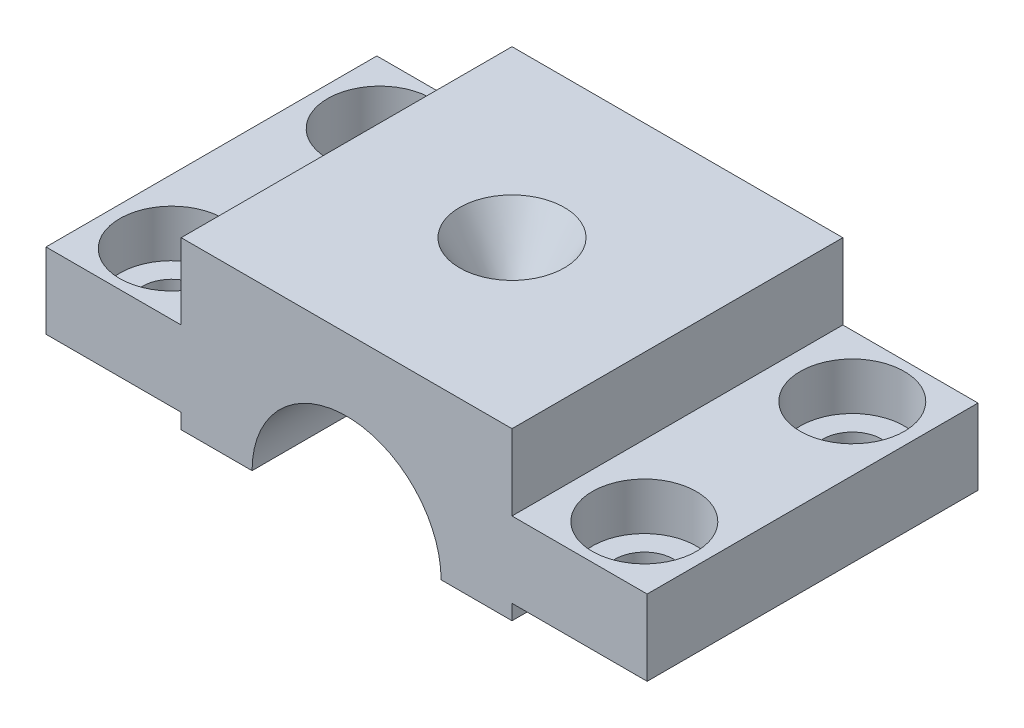
ISO-10303-21;
HEADER;
FILE_DESCRIPTION(('STEP AP214'),'2;1');
FILE_NAME('part.step','',(''),(''),'','','');
FILE_SCHEMA(('AUTOMOTIVE_DESIGN { 1 0 10303 214 1 1 1 1 }'));
ENDSEC;
DATA;
#1=APPLICATION_CONTEXT('core data for automotive mechanical design processes');
#2=APPLICATION_PROTOCOL_DEFINITION('international standard','automotive_design',2000,#1);
#3=PRODUCT_CONTEXT('',#1,'mechanical');
#4=PRODUCT('Part','Part','',(#3));
#5=PRODUCT_RELATED_PRODUCT_CATEGORY('part','',(#4));
#6=PRODUCT_DEFINITION_FORMATION('','',#4);
#7=PRODUCT_DEFINITION_CONTEXT('part definition',#1,'design');
#8=PRODUCT_DEFINITION('design','',#6,#7);
#9=PRODUCT_DEFINITION_SHAPE('','',#8);
#10=(LENGTH_UNIT() NAMED_UNIT(*) SI_UNIT(.MILLI.,.METRE.));
#11=(NAMED_UNIT(*) PLANE_ANGLE_UNIT() SI_UNIT($,.RADIAN.));
#12=(NAMED_UNIT(*) SI_UNIT($,.STERADIAN.) SOLID_ANGLE_UNIT());
#13=UNCERTAINTY_MEASURE_WITH_UNIT(LENGTH_MEASURE(1.E-05),#10,'distance_accuracy_value','');
#14=(GEOMETRIC_REPRESENTATION_CONTEXT(3) GLOBAL_UNCERTAINTY_ASSIGNED_CONTEXT((#13)) GLOBAL_UNIT_ASSIGNED_CONTEXT((#10,
#11,#12)) REPRESENTATION_CONTEXT('',''));
#15=CARTESIAN_POINT('',(0.,0.,0.));
#16=DIRECTION('',(0.,0.,1.));
#17=DIRECTION('',(1.,0.,0.));
#18=AXIS2_PLACEMENT_3D('',#15,#16,#17);
#19=CARTESIAN_POINT('',(-15.9,0.,8.75));
#20=DIRECTION('',(0.,1.,0.));
#21=DIRECTION('',(0.,0.,1.));
#22=AXIS2_PLACEMENT_3D('',#19,#20,#21);
#23=PLANE('',#22);
#24=DIRECTION('',(1.,0.,0.));
#25=VECTOR('',#24,1.);
#26=CARTESIAN_POINT('',(-15.9,0.,-8.75));
#27=LINE('',#26,#25);
#28=CARTESIAN_POINT('',(-8.75,0.,-8.75));
#29=VERTEX_POINT('',#28);
#30=CARTESIAN_POINT('',(-5.,0.,-8.75));
#31=VERTEX_POINT('',#30);
#32=EDGE_CURVE('E174',#29,#31,#27,.T.);
#33=ORIENTED_EDGE('',*,*,#32,.T.);
#34=DIRECTION('',(0.,0.,1.));
#35=VECTOR('',#34,1.);
#36=CARTESIAN_POINT('',(-5.,0.,-8.75));
#37=LINE('',#36,#35);
#38=CARTESIAN_POINT('',(-5.,0.,8.75));
#39=VERTEX_POINT('',#38);
#40=EDGE_CURVE('E11',#31,#39,#37,.T.);
#41=ORIENTED_EDGE('',*,*,#40,.T.);
#42=DIRECTION('',(1.,0.,0.));
#43=VECTOR('',#42,1.);
#44=CARTESIAN_POINT('',(-15.9,0.,8.75));
#45=LINE('',#44,#43);
#46=CARTESIAN_POINT('',(-8.75,0.,8.75));
#47=VERTEX_POINT('',#46);
#48=EDGE_CURVE('E153',#47,#39,#45,.T.);
#49=ORIENTED_EDGE('',*,*,#48,.F.);
#50=DIRECTION('',(0.,0.,-1.));
#51=VECTOR('',#50,1.);
#52=CARTESIAN_POINT('',(-8.75,0.,8.75));
#53=LINE('',#52,#51);
#54=EDGE_CURVE('E230',#47,#29,#53,.T.);
#55=ORIENTED_EDGE('',*,*,#54,.T.);
#56=EDGE_LOOP('',(#33,#41,#49,#55));
#57=FACE_BOUND('',#56,.T.);
#58=ADVANCED_FACE('F33',(#57),#23,.F.);
#59=CARTESIAN_POINT('',(0.,0.,8.75));
#60=DIRECTION('',(0.,0.,-1.));
#61=DIRECTION('',(-1.,0.,0.));
#62=AXIS2_PLACEMENT_3D('',#59,#60,#61);
#63=PLANE('',#62);
#64=ORIENTED_EDGE('',*,*,#48,.T.);
#65=CARTESIAN_POINT('',(0.,0.,8.75));
#66=DIRECTION('',(0.,0.,1.));
#67=DIRECTION('',(1.,0.,0.));
#68=AXIS2_PLACEMENT_3D('',#65,#66,#67);
#69=CIRCLE('',#68,5.);
#70=CARTESIAN_POINT('',(5.,0.,8.75));
#71=VERTEX_POINT('',#70);
#72=EDGE_CURVE('E139',#71,#39,#69,.T.);
#73=ORIENTED_EDGE('',*,*,#72,.F.);
#74=CARTESIAN_POINT('',(8.75,0.,8.75));
#75=VERTEX_POINT('',#74);
#76=EDGE_CURVE('E149',#71,#75,#45,.T.);
#77=ORIENTED_EDGE('',*,*,#76,.T.);
#78=DIRECTION('',(0.,-1.,0.));
#79=VECTOR('',#78,1.);
#80=CARTESIAN_POINT('',(8.75,0.8,8.75));
#81=LINE('',#80,#79);
#82=CARTESIAN_POINT('',(8.75,0.8,8.75));
#83=VERTEX_POINT('',#82);
#84=EDGE_CURVE('E292',#83,#75,#81,.T.);
#85=ORIENTED_EDGE('',*,*,#84,.F.);
#86=DIRECTION('',(-1.,0.,0.));
#87=VECTOR('',#86,1.);
#88=CARTESIAN_POINT('',(15.9,0.8,8.75));
#89=LINE('',#88,#87);
#90=CARTESIAN_POINT('',(15.9,0.8,8.75));
#91=VERTEX_POINT('',#90);
#92=EDGE_CURVE('E285',#91,#83,#89,.T.);
#93=ORIENTED_EDGE('',*,*,#92,.F.);
#94=DIRECTION('',(0.,1.,0.));
#95=VECTOR('',#94,1.);
#96=CARTESIAN_POINT('',(15.9,0.,8.75));
#97=LINE('',#96,#95);
#98=CARTESIAN_POINT('',(15.9,4.8,8.75));
#99=VERTEX_POINT('',#98);
#100=EDGE_CURVE('E161',#91,#99,#97,.T.);
#101=ORIENTED_EDGE('',*,*,#100,.T.);
#102=DIRECTION('',(1.,0.,0.));
#103=VECTOR('',#102,1.);
#104=CARTESIAN_POINT('',(8.75,4.8,8.75));
#105=LINE('',#104,#103);
#106=CARTESIAN_POINT('',(8.75,4.8,8.75));
#107=VERTEX_POINT('',#106);
#108=EDGE_CURVE('E270',#107,#99,#105,.T.);
#109=ORIENTED_EDGE('',*,*,#108,.F.);
#110=DIRECTION('',(0.,-1.,0.));
#111=VECTOR('',#110,1.);
#112=CARTESIAN_POINT('',(8.75,8.8,8.75));
#113=LINE('',#112,#111);
#114=CARTESIAN_POINT('',(8.75,8.8,8.75));
#115=VERTEX_POINT('',#114);
#116=EDGE_CURVE('E185',#115,#107,#113,.T.);
#117=ORIENTED_EDGE('',*,*,#116,.F.);
#118=DIRECTION('',(-1.,0.,0.));
#119=VECTOR('',#118,1.);
#120=CARTESIAN_POINT('',(-15.9,8.8,8.75));
#121=LINE('',#120,#119);
#122=CARTESIAN_POINT('',(-8.75,8.8,8.75));
#123=VERTEX_POINT('',#122);
#124=EDGE_CURVE('E143',#115,#123,#121,.T.);
#125=ORIENTED_EDGE('',*,*,#124,.T.);
#126=DIRECTION('',(0.,-1.,0.));
#127=VECTOR('',#126,1.);
#128=CARTESIAN_POINT('',(-8.75,8.8,8.75));
#129=LINE('',#128,#127);
#130=CARTESIAN_POINT('',(-8.75,4.8,8.75));
#131=VERTEX_POINT('',#130);
#132=EDGE_CURVE('E61',#123,#131,#129,.T.);
#133=ORIENTED_EDGE('',*,*,#132,.T.);
#134=DIRECTION('',(-1.,0.,0.));
#135=VECTOR('',#134,1.);
#136=CARTESIAN_POINT('',(-8.75,4.8,8.75));
#137=LINE('',#136,#135);
#138=CARTESIAN_POINT('',(-15.9,4.8,8.75));
#139=VERTEX_POINT('',#138);
#140=EDGE_CURVE('E222',#131,#139,#137,.T.);
#141=ORIENTED_EDGE('',*,*,#140,.T.);
#142=DIRECTION('',(0.,-1.,0.));
#143=VECTOR('',#142,1.);
#144=CARTESIAN_POINT('',(-15.9,0.,8.75));
#145=LINE('',#144,#143);
#146=CARTESIAN_POINT('',(-15.9,0.8,8.75));
#147=VERTEX_POINT('',#146);
#148=EDGE_CURVE('E159',#139,#147,#145,.T.);
#149=ORIENTED_EDGE('',*,*,#148,.T.);
#150=DIRECTION('',(1.,0.,0.));
#151=VECTOR('',#150,1.);
#152=CARTESIAN_POINT('',(-15.9,0.8,8.75));
#153=LINE('',#152,#151);
#154=CARTESIAN_POINT('',(-8.75,0.8,8.75));
#155=VERTEX_POINT('',#154);
#156=EDGE_CURVE('E242',#147,#155,#153,.T.);
#157=ORIENTED_EDGE('',*,*,#156,.T.);
#158=DIRECTION('',(0.,-1.,0.));
#159=VECTOR('',#158,1.);
#160=CARTESIAN_POINT('',(-8.75,0.8,8.75));
#161=LINE('',#160,#159);
#162=EDGE_CURVE('E248',#155,#47,#161,.T.);
#163=ORIENTED_EDGE('',*,*,#162,.T.);
#164=EDGE_LOOP('',(#64,#73,#77,#85,#93,#101,#109,#117,#125,#133,#141,#149,#157,#163));
#165=FACE_BOUND('',#164,.T.);
#166=ADVANCED_FACE('F147',(#165),#63,.F.);
#167=CARTESIAN_POINT('',(0.,0.,-8.75));
#168=DIRECTION('',(0.,0.,-1.));
#169=DIRECTION('',(-1.,0.,0.));
#170=AXIS2_PLACEMENT_3D('',#167,#168,#169);
#171=PLANE('',#170);
#172=CARTESIAN_POINT('',(0.,0.,-8.75));
#173=DIRECTION('',(0.,0.,1.));
#174=DIRECTION('',(1.,0.,0.));
#175=AXIS2_PLACEMENT_3D('',#172,#173,#174);
#176=CIRCLE('',#175,5.);
#177=CARTESIAN_POINT('',(5.,0.,-8.75));
#178=VERTEX_POINT('',#177);
#179=EDGE_CURVE('E53',#178,#31,#176,.T.);
#180=ORIENTED_EDGE('',*,*,#179,.T.);
#181=ORIENTED_EDGE('',*,*,#32,.F.);
#182=DIRECTION('',(0.,-1.,0.));
#183=VECTOR('',#182,1.);
#184=CARTESIAN_POINT('',(-8.75,0.8,-8.75));
#185=LINE('',#184,#183);
#186=CARTESIAN_POINT('',(-8.75,0.8,-8.75));
#187=VERTEX_POINT('',#186);
#188=EDGE_CURVE('E245',#187,#29,#185,.T.);
#189=ORIENTED_EDGE('',*,*,#188,.F.);
#190=DIRECTION('',(-1.,0.,0.));
#191=VECTOR('',#190,1.);
#192=CARTESIAN_POINT('',(-15.9,0.8,-8.75));
#193=LINE('',#192,#191);
#194=CARTESIAN_POINT('',(-15.9,0.8,-8.75));
#195=VERTEX_POINT('',#194);
#196=EDGE_CURVE('E237',#187,#195,#193,.T.);
#197=ORIENTED_EDGE('',*,*,#196,.T.);
#198=DIRECTION('',(0.,-1.,0.));
#199=VECTOR('',#198,1.);
#200=CARTESIAN_POINT('',(-15.9,0.,-8.75));
#201=LINE('',#200,#199);
#202=CARTESIAN_POINT('',(-15.9,4.8,-8.75));
#203=VERTEX_POINT('',#202);
#204=EDGE_CURVE('E170',#203,#195,#201,.T.);
#205=ORIENTED_EDGE('',*,*,#204,.F.);
#206=DIRECTION('',(-1.,0.,0.));
#207=VECTOR('',#206,1.);
#208=CARTESIAN_POINT('',(-8.75,4.8,-8.75));
#209=LINE('',#208,#207);
#210=CARTESIAN_POINT('',(-8.75,4.8,-8.75));
#211=VERTEX_POINT('',#210);
#212=EDGE_CURVE('E221',#211,#203,#209,.T.);
#213=ORIENTED_EDGE('',*,*,#212,.F.);
#214=DIRECTION('',(0.,-1.,0.));
#215=VECTOR('',#214,1.);
#216=CARTESIAN_POINT('',(-8.75,8.8,-8.75));
#217=LINE('',#216,#215);
#218=CARTESIAN_POINT('',(-8.75,8.8,-8.75));
#219=VERTEX_POINT('',#218);
#220=EDGE_CURVE('E219',#219,#211,#217,.T.);
#221=ORIENTED_EDGE('',*,*,#220,.F.);
#222=DIRECTION('',(-1.,0.,0.));
#223=VECTOR('',#222,1.);
#224=CARTESIAN_POINT('',(-15.9,8.8,-8.75));
#225=LINE('',#224,#223);
#226=CARTESIAN_POINT('',(8.75,8.8,-8.75));
#227=VERTEX_POINT('',#226);
#228=EDGE_CURVE('E162',#227,#219,#225,.T.);
#229=ORIENTED_EDGE('',*,*,#228,.F.);
#230=DIRECTION('',(0.,-1.,0.));
#231=VECTOR('',#230,1.);
#232=CARTESIAN_POINT('',(8.75,8.8,-8.75));
#233=LINE('',#232,#231);
#234=CARTESIAN_POINT('',(8.75,4.8,-8.75));
#235=VERTEX_POINT('',#234);
#236=EDGE_CURVE('E266',#227,#235,#233,.T.);
#237=ORIENTED_EDGE('',*,*,#236,.T.);
#238=DIRECTION('',(1.,0.,0.));
#239=VECTOR('',#238,1.);
#240=CARTESIAN_POINT('',(8.75,4.8,-8.75));
#241=LINE('',#240,#239);
#242=CARTESIAN_POINT('',(15.9,4.8,-8.75));
#243=VERTEX_POINT('',#242);
#244=EDGE_CURVE('E269',#235,#243,#241,.T.);
#245=ORIENTED_EDGE('',*,*,#244,.T.);
#246=DIRECTION('',(0.,1.,0.));
#247=VECTOR('',#246,1.);
#248=CARTESIAN_POINT('',(15.9,0.,-8.75));
#249=LINE('',#248,#247);
#250=CARTESIAN_POINT('',(15.9,0.8,-8.75));
#251=VERTEX_POINT('',#250);
#252=EDGE_CURVE('E177',#251,#243,#249,.T.);
#253=ORIENTED_EDGE('',*,*,#252,.F.);
#254=DIRECTION('',(1.,0.,0.));
#255=VECTOR('',#254,1.);
#256=CARTESIAN_POINT('',(15.9,0.8,-8.75));
#257=LINE('',#256,#255);
#258=CARTESIAN_POINT('',(8.75,0.8,-8.75));
#259=VERTEX_POINT('',#258);
#260=EDGE_CURVE('E290',#259,#251,#257,.T.);
#261=ORIENTED_EDGE('',*,*,#260,.F.);
#262=DIRECTION('',(0.,-1.,0.));
#263=VECTOR('',#262,1.);
#264=CARTESIAN_POINT('',(8.75,0.8,-8.75));
#265=LINE('',#264,#263);
#266=CARTESIAN_POINT('',(8.75,0.,-8.75));
#267=VERTEX_POINT('',#266);
#268=EDGE_CURVE('E173',#259,#267,#265,.T.);
#269=ORIENTED_EDGE('',*,*,#268,.T.);
#270=EDGE_CURVE('E172',#178,#267,#27,.T.);
#271=ORIENTED_EDGE('',*,*,#270,.F.);
#272=EDGE_LOOP('',(#180,#181,#189,#197,#205,#213,#221,#229,#237,#245,#253,#261,#269,#271));
#273=FACE_BOUND('',#272,.T.);
#274=ADVANCED_FACE('F310',(#273),#171,.T.);
#275=CARTESIAN_POINT('',(-15.9,0.,8.75));
#276=DIRECTION('',(1.,0.,0.));
#277=DIRECTION('',(0.,0.,-1.));
#278=AXIS2_PLACEMENT_3D('',#275,#276,#277);
#279=PLANE('',#278);
#280=DIRECTION('',(0.,0.,1.));
#281=VECTOR('',#280,1.);
#282=CARTESIAN_POINT('',(-15.9,4.8,-8.75));
#283=LINE('',#282,#281);
#284=EDGE_CURVE('E231',#203,#139,#283,.T.);
#285=ORIENTED_EDGE('',*,*,#284,.F.);
#286=ORIENTED_EDGE('',*,*,#204,.T.);
#287=DIRECTION('',(0.,0.,1.));
#288=VECTOR('',#287,1.);
#289=CARTESIAN_POINT('',(-15.9,0.8,8.75));
#290=LINE('',#289,#288);
#291=EDGE_CURVE('E234',#195,#147,#290,.T.);
#292=ORIENTED_EDGE('',*,*,#291,.T.);
#293=ORIENTED_EDGE('',*,*,#148,.F.);
#294=EDGE_LOOP('',(#285,#286,#292,#293));
#295=FACE_BOUND('',#294,.T.);
#296=ADVANCED_FACE('F35',(#295),#279,.F.);
#297=CARTESIAN_POINT('',(-15.9,8.8,8.75));
#298=DIRECTION('',(0.,-1.,0.));
#299=DIRECTION('',(0.,0.,-1.));
#300=AXIS2_PLACEMENT_3D('',#297,#298,#299);
#301=PLANE('',#300);
#302=CARTESIAN_POINT('',(0.,8.80000000000001,0.));
#303=DIRECTION('',(0.,-1.,0.));
#304=DIRECTION('',(0.,0.,-1.));
#305=AXIS2_PLACEMENT_3D('',#302,#303,#304);
#306=CIRCLE('',#305,2.77072594216366);
#307=CARTESIAN_POINT('',(0.,8.80000000000001,2.77072594216366));
#308=VERTEX_POINT('',#307);
#309=EDGE_CURVE('E342',#308,#308,#306,.T.);
#310=ORIENTED_EDGE('',*,*,#309,.T.);
#311=EDGE_LOOP('',(#310));
#312=FACE_BOUND('',#311,.T.);
#313=DIRECTION('',(0.,0.,1.));
#314=VECTOR('',#313,1.);
#315=CARTESIAN_POINT('',(-8.75,8.8,-8.75));
#316=LINE('',#315,#314);
#317=EDGE_CURVE('E224',#219,#123,#316,.T.);
#318=ORIENTED_EDGE('',*,*,#317,.T.);
#319=ORIENTED_EDGE('',*,*,#124,.F.);
#320=DIRECTION('',(0.,0.,1.));
#321=VECTOR('',#320,1.);
#322=CARTESIAN_POINT('',(8.75,8.8,-8.75));
#323=LINE('',#322,#321);
#324=EDGE_CURVE('E277',#227,#115,#323,.T.);
#325=ORIENTED_EDGE('',*,*,#324,.F.);
#326=ORIENTED_EDGE('',*,*,#228,.T.);
#327=EDGE_LOOP('',(#318,#319,#325,#326));
#328=FACE_BOUND('',#327,.T.);
#329=ADVANCED_FACE('F320',(#312,#328),#301,.F.);
#330=ORIENTED_EDGE('',*,*,#76,.F.);
#331=DIRECTION('',(0.,0.,1.));
#332=VECTOR('',#331,1.);
#333=CARTESIAN_POINT('',(5.,0.,-8.75));
#334=LINE('',#333,#332);
#335=EDGE_CURVE('E46',#71,#178,#334,.F.);
#336=ORIENTED_EDGE('',*,*,#335,.T.);
#337=ORIENTED_EDGE('',*,*,#270,.T.);
#338=DIRECTION('',(0.,0.,-1.));
#339=VECTOR('',#338,1.);
#340=CARTESIAN_POINT('',(8.75,0.,8.75));
#341=LINE('',#340,#339);
#342=EDGE_CURVE('E158',#75,#267,#341,.T.);
#343=ORIENTED_EDGE('',*,*,#342,.F.);
#344=EDGE_LOOP('',(#330,#336,#337,#343));
#345=FACE_BOUND('',#344,.T.);
#346=ADVANCED_FACE('F156',(#345),#23,.F.);
#347=CARTESIAN_POINT('',(15.9,0.,8.75));
#348=DIRECTION('',(-1.,0.,0.));
#349=DIRECTION('',(0.,0.,1.));
#350=AXIS2_PLACEMENT_3D('',#347,#348,#349);
#351=PLANE('',#350);
#352=ORIENTED_EDGE('',*,*,#252,.T.);
#353=DIRECTION('',(0.,0.,1.));
#354=VECTOR('',#353,1.);
#355=CARTESIAN_POINT('',(15.9,4.8,-8.75));
#356=LINE('',#355,#354);
#357=EDGE_CURVE('E279',#243,#99,#356,.T.);
#358=ORIENTED_EDGE('',*,*,#357,.T.);
#359=ORIENTED_EDGE('',*,*,#100,.F.);
#360=DIRECTION('',(0.,0.,1.));
#361=VECTOR('',#360,1.);
#362=CARTESIAN_POINT('',(15.9,0.8,8.75));
#363=LINE('',#362,#361);
#364=EDGE_CURVE('E283',#251,#91,#363,.T.);
#365=ORIENTED_EDGE('',*,*,#364,.F.);
#366=EDGE_LOOP('',(#352,#358,#359,#365));
#367=FACE_BOUND('',#366,.T.);
#368=ADVANCED_FACE('F304',(#367),#351,.F.);
#369=CARTESIAN_POINT('',(8.75,0.8,8.75));
#370=DIRECTION('',(-1.,0.,0.));
#371=DIRECTION('',(0.,0.,1.));
#372=AXIS2_PLACEMENT_3D('',#369,#370,#371);
#373=PLANE('',#372);
#374=ORIENTED_EDGE('',*,*,#342,.T.);
#375=ORIENTED_EDGE('',*,*,#268,.F.);
#376=DIRECTION('',(0.,0.,-1.));
#377=VECTOR('',#376,1.);
#378=CARTESIAN_POINT('',(8.75,0.8,8.75));
#379=LINE('',#378,#377);
#380=EDGE_CURVE('E288',#83,#259,#379,.T.);
#381=ORIENTED_EDGE('',*,*,#380,.F.);
#382=ORIENTED_EDGE('',*,*,#84,.T.);
#383=EDGE_LOOP('',(#374,#375,#381,#382));
#384=FACE_BOUND('',#383,.T.);
#385=ADVANCED_FACE('F296',(#384),#373,.F.);
#386=CARTESIAN_POINT('',(0.,0.8,0.));
#387=DIRECTION('',(0.,1.,0.));
#388=DIRECTION('',(0.,0.,1.));
#389=AXIS2_PLACEMENT_3D('',#386,#387,#388);
#390=PLANE('',#389);
#391=CARTESIAN_POINT('',(12.5,0.8,-5.5));
#392=DIRECTION('',(0.,1.,0.));
#393=DIRECTION('',(0.,0.,1.));
#394=AXIS2_PLACEMENT_3D('',#391,#392,#393);
#395=CIRCLE('',#394,1.55);
#396=CARTESIAN_POINT('',(12.5,0.8,-3.95));
#397=VERTEX_POINT('',#396);
#398=EDGE_CURVE('E187',#397,#397,#395,.T.);
#399=ORIENTED_EDGE('',*,*,#398,.T.);
#400=EDGE_LOOP('',(#399));
#401=FACE_BOUND('',#400,.T.);
#402=CARTESIAN_POINT('',(12.5,0.8,5.5));
#403=DIRECTION('',(0.,1.,0.));
#404=DIRECTION('',(0.,0.,1.));
#405=AXIS2_PLACEMENT_3D('',#402,#403,#404);
#406=CIRCLE('',#405,1.55);
#407=CARTESIAN_POINT('',(12.5,0.8,7.05));
#408=VERTEX_POINT('',#407);
#409=EDGE_CURVE('E182',#408,#408,#406,.T.);
#410=ORIENTED_EDGE('',*,*,#409,.T.);
#411=EDGE_LOOP('',(#410));
#412=FACE_BOUND('',#411,.T.);
#413=ORIENTED_EDGE('',*,*,#364,.T.);
#414=ORIENTED_EDGE('',*,*,#92,.T.);
#415=ORIENTED_EDGE('',*,*,#380,.T.);
#416=ORIENTED_EDGE('',*,*,#260,.T.);
#417=EDGE_LOOP('',(#413,#414,#415,#416));
#418=FACE_BOUND('',#417,.T.);
#419=ADVANCED_FACE('F390',(#401,#412,#418),#390,.F.);
#420=CARTESIAN_POINT('',(8.75,8.8,-8.75));
#421=DIRECTION('',(-1.,0.,0.));
#422=DIRECTION('',(0.,0.,1.));
#423=AXIS2_PLACEMENT_3D('',#420,#421,#422);
#424=PLANE('',#423);
#425=ORIENTED_EDGE('',*,*,#116,.T.);
#426=DIRECTION('',(0.,0.,1.));
#427=VECTOR('',#426,1.);
#428=CARTESIAN_POINT('',(8.75,4.8,-8.75));
#429=LINE('',#428,#427);
#430=EDGE_CURVE('E273',#235,#107,#429,.T.);
#431=ORIENTED_EDGE('',*,*,#430,.F.);
#432=ORIENTED_EDGE('',*,*,#236,.F.);
#433=ORIENTED_EDGE('',*,*,#324,.T.);
#434=EDGE_LOOP('',(#425,#431,#432,#433));
#435=FACE_BOUND('',#434,.T.);
#436=ADVANCED_FACE('F316',(#435),#424,.F.);
#437=CARTESIAN_POINT('',(8.75,4.8,-8.75));
#438=DIRECTION('',(0.,-1.,0.));
#439=DIRECTION('',(0.,0.,-1.));
#440=AXIS2_PLACEMENT_3D('',#437,#438,#439);
#441=PLANE('',#440);
#442=CARTESIAN_POINT('',(12.5,4.8,-5.5));
#443=DIRECTION('',(0.,1.,0.));
#444=DIRECTION('',(0.,0.,1.));
#445=AXIS2_PLACEMENT_3D('',#442,#443,#444);
#446=CIRCLE('',#445,2.75);
#447=CARTESIAN_POINT('',(12.5,4.8,-2.75));
#448=VERTEX_POINT('',#447);
#449=EDGE_CURVE('E250',#448,#448,#446,.T.);
#450=ORIENTED_EDGE('',*,*,#449,.F.);
#451=EDGE_LOOP('',(#450));
#452=FACE_BOUND('',#451,.T.);
#453=CARTESIAN_POINT('',(12.5,4.8,5.5));
#454=DIRECTION('',(0.,1.,0.));
#455=DIRECTION('',(0.,0.,1.));
#456=AXIS2_PLACEMENT_3D('',#453,#454,#455);
#457=CIRCLE('',#456,2.75);
#458=CARTESIAN_POINT('',(12.5,4.8,8.25));
#459=VERTEX_POINT('',#458);
#460=EDGE_CURVE('E190',#459,#459,#457,.T.);
#461=ORIENTED_EDGE('',*,*,#460,.F.);
#462=EDGE_LOOP('',(#461));
#463=FACE_BOUND('',#462,.T.);
#464=ORIENTED_EDGE('',*,*,#108,.T.);
#465=ORIENTED_EDGE('',*,*,#357,.F.);
#466=ORIENTED_EDGE('',*,*,#244,.F.);
#467=ORIENTED_EDGE('',*,*,#430,.T.);
#468=EDGE_LOOP('',(#464,#465,#466,#467));
#469=FACE_BOUND('',#468,.T.);
#470=ADVANCED_FACE('F308',(#452,#463,#469),#441,.F.);
#471=CARTESIAN_POINT('',(12.5,4.8,5.5));
#472=DIRECTION('',(0.,1.,0.));
#473=DIRECTION('',(0.,0.,1.));
#474=AXIS2_PLACEMENT_3D('',#471,#472,#473);
#475=CYLINDRICAL_SURFACE('',#474,1.55);
#476=CARTESIAN_POINT('',(12.5,2.3,5.5));
#477=DIRECTION('',(0.,1.,0.));
#478=DIRECTION('',(0.,0.,1.));
#479=AXIS2_PLACEMENT_3D('',#476,#477,#478);
#480=CIRCLE('',#479,1.55);
#481=CARTESIAN_POINT('',(12.5,2.3,7.05));
#482=VERTEX_POINT('',#481);
#483=EDGE_CURVE('E186',#482,#482,#480,.T.);
#484=ORIENTED_EDGE('',*,*,#483,.T.);
#485=EDGE_LOOP('',(#484));
#486=FACE_BOUND('',#485,.T.);
#487=ORIENTED_EDGE('',*,*,#409,.F.);
#488=EDGE_LOOP('',(#487));
#489=FACE_BOUND('',#488,.T.);
#490=ADVANCED_FACE('F398',(#486,#489),#475,.F.);
#491=CARTESIAN_POINT('',(14.05,2.3,5.5));
#492=DIRECTION('',(0.,-1.,0.));
#493=DIRECTION('',(0.,0.,-1.));
#494=AXIS2_PLACEMENT_3D('',#491,#492,#493);
#495=PLANE('',#494);
#496=ORIENTED_EDGE('',*,*,#483,.F.);
#497=EDGE_LOOP('',(#496));
#498=FACE_BOUND('',#497,.T.);
#499=CARTESIAN_POINT('',(12.5,2.3,5.5));
#500=DIRECTION('',(0.,1.,0.));
#501=DIRECTION('',(0.,0.,1.));
#502=AXIS2_PLACEMENT_3D('',#499,#500,#501);
#503=CIRCLE('',#502,2.75);
#504=CARTESIAN_POINT('',(12.5,2.3,8.25));
#505=VERTEX_POINT('',#504);
#506=EDGE_CURVE('E261',#505,#505,#503,.T.);
#507=ORIENTED_EDGE('',*,*,#506,.T.);
#508=EDGE_LOOP('',(#507));
#509=FACE_BOUND('',#508,.T.);
#510=ADVANCED_FACE('F402',(#498,#509),#495,.F.);
#511=CARTESIAN_POINT('',(12.5,4.8,5.5));
#512=DIRECTION('',(0.,1.,0.));
#513=DIRECTION('',(0.,0.,1.));
#514=AXIS2_PLACEMENT_3D('',#511,#512,#513);
#515=CYLINDRICAL_SURFACE('',#514,2.75);
#516=ORIENTED_EDGE('',*,*,#506,.F.);
#517=EDGE_LOOP('',(#516));
#518=FACE_BOUND('',#517,.T.);
#519=ORIENTED_EDGE('',*,*,#460,.T.);
#520=EDGE_LOOP('',(#519));
#521=FACE_BOUND('',#520,.T.);
#522=ADVANCED_FACE('F406',(#518,#521),#515,.F.);
#523=CARTESIAN_POINT('',(12.5,4.8,-5.5));
#524=DIRECTION('',(0.,1.,0.));
#525=DIRECTION('',(0.,0.,1.));
#526=AXIS2_PLACEMENT_3D('',#523,#524,#525);
#527=CYLINDRICAL_SURFACE('',#526,1.55);
#528=CARTESIAN_POINT('',(12.5,2.3,-5.5));
#529=DIRECTION('',(0.,1.,0.));
#530=DIRECTION('',(0.,0.,1.));
#531=AXIS2_PLACEMENT_3D('',#528,#529,#530);
#532=CIRCLE('',#531,1.55);
#533=CARTESIAN_POINT('',(12.5,2.3,-3.95));
#534=VERTEX_POINT('',#533);
#535=EDGE_CURVE('E191',#534,#534,#532,.T.);
#536=ORIENTED_EDGE('',*,*,#535,.T.);
#537=EDGE_LOOP('',(#536));
#538=FACE_BOUND('',#537,.T.);
#539=ORIENTED_EDGE('',*,*,#398,.F.);
#540=EDGE_LOOP('',(#539));
#541=FACE_BOUND('',#540,.T.);
#542=ADVANCED_FACE('F410',(#538,#541),#527,.F.);
#543=CARTESIAN_POINT('',(14.05,2.3,-5.5));
#544=DIRECTION('',(0.,-1.,0.));
#545=DIRECTION('',(0.,0.,-1.));
#546=AXIS2_PLACEMENT_3D('',#543,#544,#545);
#547=PLANE('',#546);
#548=ORIENTED_EDGE('',*,*,#535,.F.);
#549=EDGE_LOOP('',(#548));
#550=FACE_BOUND('',#549,.T.);
#551=CARTESIAN_POINT('',(12.5,2.3,-5.5));
#552=DIRECTION('',(0.,1.,0.));
#553=DIRECTION('',(0.,0.,1.));
#554=AXIS2_PLACEMENT_3D('',#551,#552,#553);
#555=CIRCLE('',#554,2.75);
#556=CARTESIAN_POINT('',(12.5,2.3,-2.75));
#557=VERTEX_POINT('',#556);
#558=EDGE_CURVE('E254',#557,#557,#555,.T.);
#559=ORIENTED_EDGE('',*,*,#558,.T.);
#560=EDGE_LOOP('',(#559));
#561=FACE_BOUND('',#560,.T.);
#562=ADVANCED_FACE('F414',(#550,#561),#547,.F.);
#563=CARTESIAN_POINT('',(12.5,4.8,-5.5));
#564=DIRECTION('',(0.,1.,0.));
#565=DIRECTION('',(0.,0.,1.));
#566=AXIS2_PLACEMENT_3D('',#563,#564,#565);
#567=CYLINDRICAL_SURFACE('',#566,2.75);
#568=ORIENTED_EDGE('',*,*,#558,.F.);
#569=EDGE_LOOP('',(#568));
#570=FACE_BOUND('',#569,.T.);
#571=ORIENTED_EDGE('',*,*,#449,.T.);
#572=EDGE_LOOP('',(#571));
#573=FACE_BOUND('',#572,.T.);
#574=ADVANCED_FACE('F418',(#570,#573),#567,.F.);
#575=CARTESIAN_POINT('',(-8.75,0.8,8.75));
#576=DIRECTION('',(-1.,0.,0.));
#577=DIRECTION('',(0.,0.,1.));
#578=AXIS2_PLACEMENT_3D('',#575,#576,#577);
#579=PLANE('',#578);
#580=ORIENTED_EDGE('',*,*,#54,.F.);
#581=ORIENTED_EDGE('',*,*,#162,.F.);
#582=DIRECTION('',(0.,0.,-1.));
#583=VECTOR('',#582,1.);
#584=CARTESIAN_POINT('',(-8.75,0.8,8.75));
#585=LINE('',#584,#583);
#586=EDGE_CURVE('E240',#155,#187,#585,.T.);
#587=ORIENTED_EDGE('',*,*,#586,.T.);
#588=ORIENTED_EDGE('',*,*,#188,.T.);
#589=EDGE_LOOP('',(#580,#581,#587,#588));
#590=FACE_BOUND('',#589,.T.);
#591=ADVANCED_FACE('F337',(#590),#579,.T.);
#592=CARTESIAN_POINT('',(0.,0.8,0.));
#593=DIRECTION('',(0.,1.,0.));
#594=DIRECTION('',(0.,0.,1.));
#595=AXIS2_PLACEMENT_3D('',#592,#593,#594);
#596=PLANE('',#595);
#597=CARTESIAN_POINT('',(-12.5,0.8,-5.5));
#598=DIRECTION('',(0.,1.,0.));
#599=DIRECTION('',(0.,0.,1.));
#600=AXIS2_PLACEMENT_3D('',#597,#598,#599);
#601=CIRCLE('',#600,1.55);
#602=CARTESIAN_POINT('',(-12.5,0.8,-3.95));
#603=VERTEX_POINT('',#602);
#604=EDGE_CURVE('E196',#603,#603,#601,.T.);
#605=ORIENTED_EDGE('',*,*,#604,.T.);
#606=EDGE_LOOP('',(#605));
#607=FACE_BOUND('',#606,.T.);
#608=CARTESIAN_POINT('',(-12.5,0.8,5.5));
#609=DIRECTION('',(0.,1.,0.));
#610=DIRECTION('',(0.,0.,1.));
#611=AXIS2_PLACEMENT_3D('',#608,#609,#610);
#612=CIRCLE('',#611,1.55);
#613=CARTESIAN_POINT('',(-12.5,0.8,7.05));
#614=VERTEX_POINT('',#613);
#615=EDGE_CURVE('E192',#614,#614,#612,.T.);
#616=ORIENTED_EDGE('',*,*,#615,.T.);
#617=EDGE_LOOP('',(#616));
#618=FACE_BOUND('',#617,.T.);
#619=ORIENTED_EDGE('',*,*,#291,.F.);
#620=ORIENTED_EDGE('',*,*,#196,.F.);
#621=ORIENTED_EDGE('',*,*,#586,.F.);
#622=ORIENTED_EDGE('',*,*,#156,.F.);
#623=EDGE_LOOP('',(#619,#620,#621,#622));
#624=FACE_BOUND('',#623,.T.);
#625=ADVANCED_FACE('F331',(#607,#618,#624),#596,.F.);
#626=CARTESIAN_POINT('',(-8.75,8.8,-8.75));
#627=DIRECTION('',(-1.,0.,0.));
#628=DIRECTION('',(0.,0.,1.));
#629=AXIS2_PLACEMENT_3D('',#626,#627,#628);
#630=PLANE('',#629);
#631=ORIENTED_EDGE('',*,*,#132,.F.);
#632=ORIENTED_EDGE('',*,*,#317,.F.);
#633=ORIENTED_EDGE('',*,*,#220,.T.);
#634=DIRECTION('',(0.,0.,1.));
#635=VECTOR('',#634,1.);
#636=CARTESIAN_POINT('',(-8.75,4.8,-8.75));
#637=LINE('',#636,#635);
#638=EDGE_CURVE('E228',#211,#131,#637,.T.);
#639=ORIENTED_EDGE('',*,*,#638,.T.);
#640=EDGE_LOOP('',(#631,#632,#633,#639));
#641=FACE_BOUND('',#640,.T.);
#642=ADVANCED_FACE('F427',(#641),#630,.T.);
#643=CARTESIAN_POINT('',(-8.75,4.8,-8.75));
#644=DIRECTION('',(0.,1.,0.));
#645=DIRECTION('',(0.,0.,1.));
#646=AXIS2_PLACEMENT_3D('',#643,#644,#645);
#647=PLANE('',#646);
#648=CARTESIAN_POINT('',(-12.5,4.8,-5.5));
#649=DIRECTION('',(0.,1.,0.));
#650=DIRECTION('',(0.,0.,1.));
#651=AXIS2_PLACEMENT_3D('',#648,#649,#650);
#652=CIRCLE('',#651,2.75);
#653=CARTESIAN_POINT('',(-12.5,4.8,-2.75));
#654=VERTEX_POINT('',#653);
#655=EDGE_CURVE('E211',#654,#654,#652,.T.);
#656=ORIENTED_EDGE('',*,*,#655,.F.);
#657=EDGE_LOOP('',(#656));
#658=FACE_BOUND('',#657,.T.);
#659=CARTESIAN_POINT('',(-12.5,4.8,5.5));
#660=DIRECTION('',(0.,1.,0.));
#661=DIRECTION('',(0.,0.,1.));
#662=AXIS2_PLACEMENT_3D('',#659,#660,#661);
#663=CIRCLE('',#662,2.75);
#664=CARTESIAN_POINT('',(-12.5,4.8,8.25));
#665=VERTEX_POINT('',#664);
#666=EDGE_CURVE('E198',#665,#665,#663,.T.);
#667=ORIENTED_EDGE('',*,*,#666,.F.);
#668=EDGE_LOOP('',(#667));
#669=FACE_BOUND('',#668,.T.);
#670=ORIENTED_EDGE('',*,*,#140,.F.);
#671=ORIENTED_EDGE('',*,*,#638,.F.);
#672=ORIENTED_EDGE('',*,*,#212,.T.);
#673=ORIENTED_EDGE('',*,*,#284,.T.);
#674=EDGE_LOOP('',(#670,#671,#672,#673));
#675=FACE_BOUND('',#674,.T.);
#676=ADVANCED_FACE('F430',(#658,#669,#675),#647,.T.);
#677=CARTESIAN_POINT('',(-12.5,4.8,5.5));
#678=DIRECTION('',(0.,1.,0.));
#679=DIRECTION('',(0.,0.,1.));
#680=AXIS2_PLACEMENT_3D('',#677,#678,#679);
#681=CYLINDRICAL_SURFACE('',#680,1.55);
#682=CARTESIAN_POINT('',(-12.5,2.3,5.5));
#683=DIRECTION('',(0.,1.,0.));
#684=DIRECTION('',(0.,0.,1.));
#685=AXIS2_PLACEMENT_3D('',#682,#683,#684);
#686=CIRCLE('',#685,1.55);
#687=CARTESIAN_POINT('',(-12.5,2.3,7.05));
#688=VERTEX_POINT('',#687);
#689=EDGE_CURVE('E195',#688,#688,#686,.T.);
#690=ORIENTED_EDGE('',*,*,#689,.T.);
#691=EDGE_LOOP('',(#690));
#692=FACE_BOUND('',#691,.T.);
#693=ORIENTED_EDGE('',*,*,#615,.F.);
#694=EDGE_LOOP('',(#693));
#695=FACE_BOUND('',#694,.T.);
#696=ADVANCED_FACE('F433',(#692,#695),#681,.F.);
#697=CARTESIAN_POINT('',(-10.95,2.3,5.5));
#698=DIRECTION('',(0.,-1.,0.));
#699=DIRECTION('',(0.,0.,-1.));
#700=AXIS2_PLACEMENT_3D('',#697,#698,#699);
#701=PLANE('',#700);
#702=ORIENTED_EDGE('',*,*,#689,.F.);
#703=EDGE_LOOP('',(#702));
#704=FACE_BOUND('',#703,.T.);
#705=CARTESIAN_POINT('',(-12.5,2.3,5.5));
#706=DIRECTION('',(0.,1.,0.));
#707=DIRECTION('',(0.,0.,1.));
#708=AXIS2_PLACEMENT_3D('',#705,#706,#707);
#709=CIRCLE('',#708,2.75);
#710=CARTESIAN_POINT('',(-12.5,2.3,8.25));
#711=VERTEX_POINT('',#710);
#712=EDGE_CURVE('E203',#711,#711,#709,.T.);
#713=ORIENTED_EDGE('',*,*,#712,.T.);
#714=EDGE_LOOP('',(#713));
#715=FACE_BOUND('',#714,.T.);
#716=ADVANCED_FACE('F437',(#704,#715),#701,.F.);
#717=CARTESIAN_POINT('',(-12.5,4.8,5.5));
#718=DIRECTION('',(0.,1.,0.));
#719=DIRECTION('',(0.,0.,1.));
#720=AXIS2_PLACEMENT_3D('',#717,#718,#719);
#721=CYLINDRICAL_SURFACE('',#720,2.75);
#722=ORIENTED_EDGE('',*,*,#712,.F.);
#723=EDGE_LOOP('',(#722));
#724=FACE_BOUND('',#723,.T.);
#725=ORIENTED_EDGE('',*,*,#666,.T.);
#726=EDGE_LOOP('',(#725));
#727=FACE_BOUND('',#726,.T.);
#728=ADVANCED_FACE('F441',(#724,#727),#721,.F.);
#729=CARTESIAN_POINT('',(-12.5,4.8,-5.5));
#730=DIRECTION('',(0.,1.,0.));
#731=DIRECTION('',(0.,0.,1.));
#732=AXIS2_PLACEMENT_3D('',#729,#730,#731);
#733=CYLINDRICAL_SURFACE('',#732,1.55);
#734=CARTESIAN_POINT('',(-12.5,2.3,-5.5));
#735=DIRECTION('',(0.,1.,0.));
#736=DIRECTION('',(0.,0.,1.));
#737=AXIS2_PLACEMENT_3D('',#734,#735,#736);
#738=CIRCLE('',#737,1.55);
#739=CARTESIAN_POINT('',(-12.5,2.3,-3.95));
#740=VERTEX_POINT('',#739);
#741=EDGE_CURVE('E199',#740,#740,#738,.T.);
#742=ORIENTED_EDGE('',*,*,#741,.T.);
#743=EDGE_LOOP('',(#742));
#744=FACE_BOUND('',#743,.T.);
#745=ORIENTED_EDGE('',*,*,#604,.F.);
#746=EDGE_LOOP('',(#745));
#747=FACE_BOUND('',#746,.T.);
#748=ADVANCED_FACE('F445',(#744,#747),#733,.F.);
#749=CARTESIAN_POINT('',(-10.95,2.3,-5.5));
#750=DIRECTION('',(0.,-1.,0.));
#751=DIRECTION('',(0.,0.,-1.));
#752=AXIS2_PLACEMENT_3D('',#749,#750,#751);
#753=PLANE('',#752);
#754=ORIENTED_EDGE('',*,*,#741,.F.);
#755=EDGE_LOOP('',(#754));
#756=FACE_BOUND('',#755,.T.);
#757=CARTESIAN_POINT('',(-12.5,2.3,-5.5));
#758=DIRECTION('',(0.,1.,0.));
#759=DIRECTION('',(0.,0.,1.));
#760=AXIS2_PLACEMENT_3D('',#757,#758,#759);
#761=CIRCLE('',#760,2.75);
#762=CARTESIAN_POINT('',(-12.5,2.3,-2.75));
#763=VERTEX_POINT('',#762);
#764=EDGE_CURVE('E206',#763,#763,#761,.T.);
#765=ORIENTED_EDGE('',*,*,#764,.T.);
#766=EDGE_LOOP('',(#765));
#767=FACE_BOUND('',#766,.T.);
#768=ADVANCED_FACE('F364',(#756,#767),#753,.F.);
#769=CARTESIAN_POINT('',(-12.5,4.8,-5.5));
#770=DIRECTION('',(0.,1.,0.));
#771=DIRECTION('',(0.,0.,1.));
#772=AXIS2_PLACEMENT_3D('',#769,#770,#771);
#773=CYLINDRICAL_SURFACE('',#772,2.75);
#774=ORIENTED_EDGE('',*,*,#764,.F.);
#775=EDGE_LOOP('',(#774));
#776=FACE_BOUND('',#775,.T.);
#777=ORIENTED_EDGE('',*,*,#655,.T.);
#778=EDGE_LOOP('',(#777));
#779=FACE_BOUND('',#778,.T.);
#780=ADVANCED_FACE('F358',(#776,#779),#773,.F.);
#781=CARTESIAN_POINT('',(0.,0.,-8.75));
#782=DIRECTION('',(0.,0.,1.));
#783=DIRECTION('',(1.,0.,0.));
#784=AXIS2_PLACEMENT_3D('',#781,#782,#783);
#785=CYLINDRICAL_SURFACE('',#784,5.);
#786=CARTESIAN_POINT('',(0.,5.,-0.75));
#787=CARTESIAN_POINT('',(-0.041875772240821,4.99999932885648,-0.749998273092379));
#788=CARTESIAN_POINT('',(-0.0837758425410658,4.9994684126852,-0.746480999579683));
#789=CARTESIAN_POINT('',(-0.166404813997456,4.99740157986593,-0.732508400008625));
#790=CARTESIAN_POINT('',(-0.207132534487115,4.99586468469237,-0.722046318527553));
#791=CARTESIAN_POINT('',(-0.28620904311093,4.99195860609763,-0.694503747516188));
#792=CARTESIAN_POINT('',(-0.324559603913399,4.9895900518546,-0.677428260247025));
#793=CARTESIAN_POINT('',(-0.397845214317627,4.98428237955862,-0.637155810291569));
#794=CARTESIAN_POINT('',(-0.432780737362594,4.98134334076386,-0.613959697791319));
#795=CARTESIAN_POINT('',(-0.498523359781063,4.97519585495726,-0.561911367530063));
#796=CARTESIAN_POINT('',(-0.52929991611275,4.97198566945166,-0.533020771895898));
#797=CARTESIAN_POINT('',(-0.585587453344743,4.96567130566619,-0.470486155553066));
#798=CARTESIAN_POINT('',(-0.611098131364678,4.96256713349252,-0.43684186161074));
#799=CARTESIAN_POINT('',(-0.656248647499714,4.95679938729363,-0.365549678238755));
#800=CARTESIAN_POINT('',(-0.675858935186025,4.95413805987515,-0.327882876509332));
#801=CARTESIAN_POINT('',(-0.70846316085528,4.94958105653134,-0.249743589677286));
#802=CARTESIAN_POINT('',(-0.721457459445815,4.94768533887724,-0.209271257628054));
#803=CARTESIAN_POINT('',(-0.740365993994555,4.94489128109337,-0.126990979064143));
#804=CARTESIAN_POINT('',(-0.746332518202588,4.94398557870625,-0.0851953032959886));
#805=CARTESIAN_POINT('',(-0.751178120169662,4.94325174485291,-0.00118691700636115));
#806=CARTESIAN_POINT('',(-0.750057604868981,4.94342355151574,0.0410257694312468));
#807=CARTESIAN_POINT('',(-0.740803666253938,4.94481859176205,0.124300540097071));
#808=CARTESIAN_POINT('',(-0.732728479638752,4.94603309380775,0.165369263242401));
#809=CARTESIAN_POINT('',(-0.709885587018671,4.94936304063184,0.245562184435765));
#810=CARTESIAN_POINT('',(-0.695117691689061,4.9514785108969,0.284686327440372));
#811=CARTESIAN_POINT('',(-0.659248017648683,4.9563816777274,0.360056685641429));
#812=CARTESIAN_POINT('',(-0.638121571415989,4.95917198383263,0.396290984546195));
#813=CARTESIAN_POINT('',(-0.590152065644774,4.96510853787274,0.464722297890967));
#814=CARTESIAN_POINT('',(-0.563308630912391,4.9682548091625,0.496919047134685));
#815=CARTESIAN_POINT('',(-0.504347465391239,4.97458736528105,0.556698830369859));
#816=CARTESIAN_POINT('',(-0.472179664821001,4.97777373556407,0.58423249514317));
#817=CARTESIAN_POINT('',(-0.403653544947093,4.98379823824231,0.633517967253631));
#818=CARTESIAN_POINT('',(-0.367295207294085,4.98663636911255,0.655269749271948));
#819=CARTESIAN_POINT('',(-0.291377299106843,4.99164757792696,0.692376543249773));
#820=CARTESIAN_POINT('',(-0.25181583891839,4.99382025962714,0.707727745920148));
#821=CARTESIAN_POINT('',(-0.17063659124353,4.99725245278535,0.731554694842688));
#822=CARTESIAN_POINT('',(-0.1290189429763,4.99851202597734,0.740030905907788));
#823=CARTESIAN_POINT('',(-0.0453347838218231,4.99996790566936,0.749801614908348));
#824=CARTESIAN_POINT('',(-0.00327636593523508,5.00017426045194,0.751163985689662));
#825=CARTESIAN_POINT('',(0.0804683388311415,4.99952780507613,0.746848497344489));
#826=CARTESIAN_POINT('',(0.122154637190939,4.99867502770684,0.741170856165952));
#827=CARTESIAN_POINT('',(0.203766193715704,4.99601234307667,0.722992949911229));
#828=CARTESIAN_POINT('',(0.243698981539919,4.99420707603992,0.710525751984578));
#829=CARTESIAN_POINT('',(0.3209074793215,4.98984117829185,0.679157501269122));
#830=CARTESIAN_POINT('',(0.35818306439755,4.98728051210783,0.660256146333185));
#831=CARTESIAN_POINT('',(0.429317489645961,4.98166341234343,0.616396887718071));
#832=CARTESIAN_POINT('',(0.463149504945783,4.97860350813373,0.591395929993614));
#833=CARTESIAN_POINT('',(0.526161836588853,4.97233931506082,0.536107094185628));
#834=CARTESIAN_POINT('',(0.555341882396701,4.96913501781434,0.505818908837676));
#835=CARTESIAN_POINT('',(0.608468924785977,4.96291132152247,0.440513233411756));
#836=CARTESIAN_POINT('',(0.632370423737106,4.95989368008794,0.405458537402616));
#837=CARTESIAN_POINT('',(0.673945646352921,4.95441609552452,0.331791979744115));
#838=CARTESIAN_POINT('',(0.691619538282179,4.95195613732814,0.293180214239268));
#839=CARTESIAN_POINT('',(0.720167336619717,4.94788516504322,0.213631233188436));
#840=CARTESIAN_POINT('',(0.731065185708177,4.94627116503219,0.172702769514379));
#841=CARTESIAN_POINT('',(0.745827747507932,4.94406691148901,0.0895704922824471));
#842=CARTESIAN_POINT('',(0.749692945915333,4.94347658725885,0.0473667670026632));
#843=CARTESIAN_POINT('',(0.750268933347199,4.94338916305421,-0.0366645316578908));
#844=CARTESIAN_POINT('',(0.747051260836564,4.94388113166751,-0.0784916208784606));
#845=CARTESIAN_POINT('',(0.733706147721894,4.94587910305587,-0.161002631661758));
#846=CARTESIAN_POINT('',(0.723578718193135,4.94738510420559,-0.201686555056696));
#847=CARTESIAN_POINT('',(0.696726867593326,4.95123763056149,-0.280736541117162));
#848=CARTESIAN_POINT('',(0.68000744662157,4.95358351858038,-0.319104335216719));
#849=CARTESIAN_POINT('',(0.640453338211545,4.95885227278851,-0.3925018169012));
#850=CARTESIAN_POINT('',(0.61761844370751,4.96177515851362,-0.427531391401822));
#851=CARTESIAN_POINT('',(0.566221688295821,4.96790371682469,-0.493621528987586));
#852=CARTESIAN_POINT('',(0.537606845199029,4.97111183940983,-0.524640666623533));
#853=CARTESIAN_POINT('',(0.475574420541418,4.97742894413318,-0.581462277393912));
#854=CARTESIAN_POINT('',(0.442155724175471,4.98053790305379,-0.60726353628808));
#855=CARTESIAN_POINT('',(0.371247853771861,4.9863259289526,-0.653043838303682));
#856=CARTESIAN_POINT('',(0.333737288382381,4.9890025356441,-0.672990054607373));
#857=CARTESIAN_POINT('',(0.25587593512436,4.9936001440148,-0.706269258379023));
#858=CARTESIAN_POINT('',(0.215528138548352,4.99552192782878,-0.719609095026844));
#859=CARTESIAN_POINT('',(0.145832863944664,4.99795469630753,-0.736270671355054));
#860=CARTESIAN_POINT('',(0.116915566747639,4.99871774589778,-0.741411300769406));
#861=CARTESIAN_POINT('',(0.0586694858000626,4.99974062973948,-0.748276548856322));
#862=CARTESIAN_POINT('',(0.0293407071672086,5.00000047024387,-0.750001209976273));
#863=CARTESIAN_POINT('',(0.,5.,-0.75));
#864=B_SPLINE_CURVE_WITH_KNOTS('',3,(#786,#787,#788,#789,#790,#791,#792,#793,#794,#795,#796,
#797,#798,#799,#800,#801,#802,#803,#804,#805,#806,#807,#808,#809,#810,#811,#812,#813,#814,#815,
#816,#817,#818,#819,#820,#821,#822,#823,#824,#825,#826,#827,#828,#829,#830,#831,#832,#833,#834,
#835,#836,#837,#838,#839,#840,#841,#842,#843,#844,#845,#846,#847,#848,#849,#850,#851,#852,#853,
#854,#855,#856,#857,#858,#859,#860,#861,#862,#863),.UNSPECIFIED.,.T.,.F.,(4,2,2,2,2,2,2,2,2,2,2,
2,2,2,2,2,2,2,2,2,2,2,2,2,2,2,2,2,2,2,2,2,2,2,2,2,2,2,4),(0.,0.125520102515832,
0.251162481464575,0.376710011791619,0.502240112098799,0.628647080684217,0.7550613178629,
0.882098511976875,1.00912878112753,1.13520782302962,1.26127962549491,1.38630588597873,
1.51133568345181,1.6368569173808,1.76238639154267,1.88917145627704,2.01595707619334,
2.14281804492437,2.26967043596701,2.39531029272128,2.52094625995578,2.64597574482974,
2.77101110188137,2.89695594018454,3.02290810014315,3.14990683292336,3.27690213404416,
3.40344611728584,3.52998136068588,3.65524444130532,3.78050732114782,3.90567536992073,
4.0308476573344,4.1572241498286,4.28363001734367,4.41073161692367,4.53770116630721,
4.62564925989404,4.71359626061645),.UNSPECIFIED.);
#865=CARTESIAN_POINT('',(0.,5.,-0.75));
#866=VERTEX_POINT('',#865);
#867=EDGE_CURVE('E37',#866,#866,#864,.T.);
#868=ORIENTED_EDGE('',*,*,#867,.T.);
#869=EDGE_LOOP('',(#868));
#870=FACE_BOUND('',#869,.T.);
#871=ORIENTED_EDGE('',*,*,#179,.F.);
#872=ORIENTED_EDGE('',*,*,#335,.F.);
#873=ORIENTED_EDGE('',*,*,#72,.T.);
#874=ORIENTED_EDGE('',*,*,#40,.F.);
#875=EDGE_LOOP('',(#871,#872,#873,#874));
#876=FACE_BOUND('',#875,.T.);
#877=ADVANCED_FACE('F138',(#870,#876),#785,.F.);
#878=CARTESIAN_POINT('',(0.,0.,0.));
#879=DIRECTION('',(0.,-1.,0.));
#880=DIRECTION('',(0.,0.,-1.));
#881=AXIS2_PLACEMENT_3D('',#878,#879,#880);
#882=CYLINDRICAL_SURFACE('',#881,0.75);
#883=CARTESIAN_POINT('',(0.,5.30000000000001,0.));
#884=DIRECTION('',(0.,-1.,0.));
#885=DIRECTION('',(0.,0.,-1.));
#886=AXIS2_PLACEMENT_3D('',#883,#884,#885);
#887=CIRCLE('',#886,0.75);
#888=CARTESIAN_POINT('',(0.,5.30000000000001,0.75));
#889=VERTEX_POINT('',#888);
#890=EDGE_CURVE('E345',#889,#889,#887,.T.);
#891=ORIENTED_EDGE('',*,*,#890,.F.);
#892=EDGE_LOOP('',(#891));
#893=FACE_BOUND('',#892,.T.);
#894=ORIENTED_EDGE('',*,*,#867,.F.);
#895=EDGE_LOOP('',(#894));
#896=FACE_BOUND('',#895,.T.);
#897=ADVANCED_FACE('F351',(#893,#896),#882,.F.);
#898=CARTESIAN_POINT('',(0.,5.30000000000001,0.));
#899=DIRECTION('',(0.,1.,0.));
#900=DIRECTION('',(0.,0.,1.));
#901=AXIS2_PLACEMENT_3D('',#898,#899,#900);
#902=CONICAL_SURFACE('',#901,0.75,0.523598775598293);
#903=CARTESIAN_POINT('',(0.,8.80000000000001,2.77072594216366));
#904=CARTESIAN_POINT('',(0.,8.76354166666667,2.74967671359946));
#905=CARTESIAN_POINT('',(0.,8.72708333333334,2.72862748503525));
#906=CARTESIAN_POINT('',(0.,8.65416666666667,2.68652902790684));
#907=CARTESIAN_POINT('',(0.,8.61770833333334,2.66547979934264));
#908=CARTESIAN_POINT('',(0.,8.54479166666667,2.62338134221423));
#909=CARTESIAN_POINT('',(0.,8.50833333333334,2.60233211365002));
#910=CARTESIAN_POINT('',(0.,8.43541666666667,2.56023365652161));
#911=CARTESIAN_POINT('',(0.,8.39895833333334,2.53918442795741));
#912=CARTESIAN_POINT('',(0.,8.32604166666667,2.497085970829));
#913=CARTESIAN_POINT('',(0.,8.28958333333334,2.47603674226479));
#914=CARTESIAN_POINT('',(0.,8.21666666666667,2.43393828513639));
#915=CARTESIAN_POINT('',(0.,8.18020833333334,2.41288905657218));
#916=CARTESIAN_POINT('',(0.,8.10729166666667,2.37079059944377));
#917=CARTESIAN_POINT('',(0.,8.07083333333334,2.34974137087957));
#918=CARTESIAN_POINT('',(0.,7.99791666666667,2.30764291375116));
#919=CARTESIAN_POINT('',(0.,7.96145833333334,2.28659368518695));
#920=CARTESIAN_POINT('',(0.,7.88854166666667,2.24449522805854));
#921=CARTESIAN_POINT('',(0.,7.85208333333334,2.22344599949434));
#922=CARTESIAN_POINT('',(0.,7.77916666666667,2.18134754236593));
#923=CARTESIAN_POINT('',(0.,7.74270833333334,2.16029831380172));
#924=CARTESIAN_POINT('',(0.,7.66979166666667,2.11819985667331));
#925=CARTESIAN_POINT('',(0.,7.63333333333334,2.09715062810911));
#926=CARTESIAN_POINT('',(0.,7.56041666666667,2.0550521709807));
#927=CARTESIAN_POINT('',(0.,7.52395833333334,2.03400294241649));
#928=CARTESIAN_POINT('',(0.,7.45104166666667,1.99190448528808));
#929=CARTESIAN_POINT('',(0.,7.41458333333334,1.97085525672388));
#930=CARTESIAN_POINT('',(0.,7.34166666666667,1.92875679959547));
#931=CARTESIAN_POINT('',(0.,7.30520833333334,1.90770757103126));
#932=CARTESIAN_POINT('',(0.,7.23229166666667,1.86560911390286));
#933=CARTESIAN_POINT('',(0.,7.19583333333334,1.84455988533865));
#934=CARTESIAN_POINT('',(0.,7.12291666666667,1.80246142821024));
#935=CARTESIAN_POINT('',(0.,7.08645833333334,1.78141219964604));
#936=CARTESIAN_POINT('',(0.,7.01354166666667,1.73931374251763));
#937=CARTESIAN_POINT('',(0.,6.97708333333334,1.71826451395342));
#938=CARTESIAN_POINT('',(0.,6.90416666666667,1.67616605682501));
#939=CARTESIAN_POINT('',(0.,6.86770833333334,1.65511682826081));
#940=CARTESIAN_POINT('',(0.,6.79479166666667,1.6130183711324));
#941=CARTESIAN_POINT('',(0.,6.75833333333334,1.59196914256819));
#942=CARTESIAN_POINT('',(0.,6.68541666666667,1.54987068543978));
#943=CARTESIAN_POINT('',(0.,6.64895833333334,1.52882145687558));
#944=CARTESIAN_POINT('',(0.,6.57604166666667,1.48672299974717));
#945=CARTESIAN_POINT('',(0.,6.53958333333334,1.46567377118296));
#946=CARTESIAN_POINT('',(0.,6.46666666666667,1.42357531405455));
#947=CARTESIAN_POINT('',(0.,6.43020833333334,1.40252608549035));
#948=CARTESIAN_POINT('',(0.,6.35729166666667,1.36042762836194));
#949=CARTESIAN_POINT('',(0.,6.32083333333334,1.33937839979773));
#950=CARTESIAN_POINT('',(0.,6.24791666666667,1.29727994266933));
#951=CARTESIAN_POINT('',(0.,6.21145833333334,1.27623071410512));
#952=CARTESIAN_POINT('',(0.,6.13854166666667,1.23413225697671));
#953=CARTESIAN_POINT('',(0.,6.10208333333334,1.21308302841251));
#954=CARTESIAN_POINT('',(0.,6.02916666666667,1.1709845712841));
#955=CARTESIAN_POINT('',(0.,5.99270833333334,1.14993534271989));
#956=CARTESIAN_POINT('',(0.,5.91979166666667,1.10783688559148));
#957=CARTESIAN_POINT('',(0.,5.88333333333334,1.08678765702728));
#958=CARTESIAN_POINT('',(0.,5.81041666666667,1.04468919989887));
#959=CARTESIAN_POINT('',(0.,5.77395833333334,1.02363997133466));
#960=CARTESIAN_POINT('',(0.,5.70104166666667,0.981541514206253));
#961=CARTESIAN_POINT('',(0.,5.66458333333334,0.960492285642048));
#962=CARTESIAN_POINT('',(0.,5.59166666666667,0.918393828513639));
#963=CARTESIAN_POINT('',(0.,5.55520833333334,0.897344599949434));
#964=CARTESIAN_POINT('',(0.,5.48229166666667,0.855246142821025));
#965=CARTESIAN_POINT('',(0.,5.44583333333334,0.83419691425682));
#966=CARTESIAN_POINT('',(0.,5.37291666666667,0.79209845712841));
#967=CARTESIAN_POINT('',(0.,5.33645833333334,0.771049228564205));
#968=CARTESIAN_POINT('',(0.,5.30000000000001,0.75));
#969=B_SPLINE_CURVE_WITH_KNOTS('',3,(#903,#904,#905,#906,#907,#908,#909,#910,#911,#912,#913,
#914,#915,#916,#917,#918,#919,#920,#921,#922,#923,#924,#925,#926,#927,#928,#929,#930,#931,#932,
#933,#934,#935,#936,#937,#938,#939,#940,#941,#942,#943,#944,#945,#946,#947,#948,#949,#950,#951,
#952,#953,#954,#955,#956,#957,#958,#959,#960,#961,#962,#963,#964,#965,#966,#967,#968),
.UNSPECIFIED.,.F.,.F.,(4,2,2,2,2,2,2,2,2,2,2,2,2,2,2,2,2,2,2,2,2,2,2,2,2,2,2,2,2,2,2,2,4),(0.,
0.126295371385229,0.252590742770461,0.378886114155689,0.505181485540919,0.63147685692615,
0.75777222831138,0.88406759969661,1.01036297108184,1.13665834246707,1.2629537138523,
1.38924908523753,1.51554445662276,1.64183982800799,1.76813519939322,1.89443057077845,
2.02072594216368,2.14702131354891,2.27331668493414,2.39961205631937,2.5259074277046,
2.65220279908983,2.77849817047506,2.90479354186029,3.03108891324552,3.15738428463075,
3.28367965601598,3.40997502740121,3.53627039878644,3.66256577017167,3.7888611415569,
3.91515651294213,4.04145188432736),.UNSPECIFIED.);
#970=EDGE_CURVE('BSEAM349',#308,#889,#969,.T.);
#971=ORIENTED_EDGE('',*,*,#309,.F.);
#972=ORIENTED_EDGE('',*,*,#890,.T.);
#973=ORIENTED_EDGE('',*,*,#970,.T.);
#974=ORIENTED_EDGE('',*,*,#970,.F.);
#975=EDGE_LOOP('',(#971,#973,#972,#974));
#976=FACE_BOUND('',#975,.T.);
#977=ADVANCED_FACE('F349',(#976),#902,.F.);
#978=CLOSED_SHELL('',(#58,#166,#274,#296,#329,#346,#368,#385,#419,#436,#470,#490,#510,#522,#542,
#562,#574,#591,#625,#642,#676,#696,#716,#728,#748,#768,#780,#877,#897,#977));
#979=MANIFOLD_SOLID_BREP('B2',#978);
#980=ADVANCED_BREP_SHAPE_REPRESENTATION('',(#18,#979),#14);
#981=SHAPE_DEFINITION_REPRESENTATION(#9,#980);
ENDSEC;
END-ISO-10303-21;
